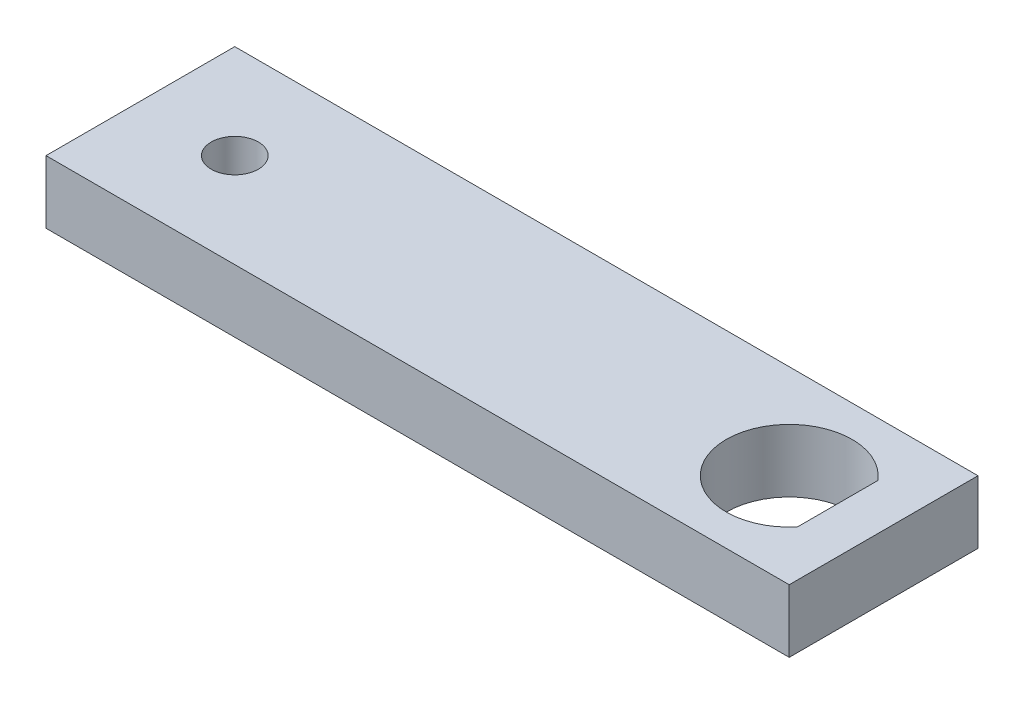
ISO-10303-21;
HEADER;
FILE_DESCRIPTION(('STEP AP214'),'2;1');
FILE_NAME('part.step','',(''),(''),'','','');
FILE_SCHEMA(('AUTOMOTIVE_DESIGN { 1 0 10303 214 1 1 1 1 }'));
ENDSEC;
DATA;
#1=APPLICATION_CONTEXT('core data for automotive mechanical design processes');
#2=APPLICATION_PROTOCOL_DEFINITION('international standard','automotive_design',2000,#1);
#3=PRODUCT_CONTEXT('',#1,'mechanical');
#4=PRODUCT('Part','Part','',(#3));
#5=PRODUCT_RELATED_PRODUCT_CATEGORY('part','',(#4));
#6=PRODUCT_DEFINITION_FORMATION('','',#4);
#7=PRODUCT_DEFINITION_CONTEXT('part definition',#1,'design');
#8=PRODUCT_DEFINITION('design','',#6,#7);
#9=PRODUCT_DEFINITION_SHAPE('','',#8);
#10=(LENGTH_UNIT() NAMED_UNIT(*) SI_UNIT(.MILLI.,.METRE.));
#11=(NAMED_UNIT(*) PLANE_ANGLE_UNIT() SI_UNIT($,.RADIAN.));
#12=(NAMED_UNIT(*) SI_UNIT($,.STERADIAN.) SOLID_ANGLE_UNIT());
#13=UNCERTAINTY_MEASURE_WITH_UNIT(LENGTH_MEASURE(1.E-05),#10,'distance_accuracy_value','');
#14=(GEOMETRIC_REPRESENTATION_CONTEXT(3) GLOBAL_UNCERTAINTY_ASSIGNED_CONTEXT((#13)) GLOBAL_UNIT_ASSIGNED_CONTEXT((#10,
#11,#12)) REPRESENTATION_CONTEXT('',''));
#15=CARTESIAN_POINT('',(0.,0.,0.));
#16=DIRECTION('',(0.,0.,1.));
#17=DIRECTION('',(1.,0.,0.));
#18=AXIS2_PLACEMENT_3D('',#15,#16,#17);
#19=CARTESIAN_POINT('',(0.,0.,19.05));
#20=DIRECTION('',(-1.,0.,0.));
#21=DIRECTION('',(0.,0.,1.));
#22=AXIS2_PLACEMENT_3D('',#19,#20,#21);
#23=PLANE('',#22);
#24=DIRECTION('',(0.,1.,0.));
#25=VECTOR('',#24,1.);
#26=CARTESIAN_POINT('',(0.,0.,0.));
#27=LINE('',#26,#25);
#28=CARTESIAN_POINT('',(0.,0.,0.));
#29=VERTEX_POINT('',#28);
#30=CARTESIAN_POINT('',(0.,6.35000000000001,0.));
#31=VERTEX_POINT('',#30);
#32=EDGE_CURVE('E107',#29,#31,#27,.T.);
#33=ORIENTED_EDGE('',*,*,#32,.F.);
#34=DIRECTION('',(0.,0.,-1.));
#35=VECTOR('',#34,1.);
#36=CARTESIAN_POINT('',(0.,0.,19.05));
#37=LINE('',#36,#35);
#38=CARTESIAN_POINT('',(0.,0.,19.05));
#39=VERTEX_POINT('',#38);
#40=EDGE_CURVE('E11',#39,#29,#37,.T.);
#41=ORIENTED_EDGE('',*,*,#40,.F.);
#42=DIRECTION('',(0.,1.,0.));
#43=VECTOR('',#42,1.);
#44=CARTESIAN_POINT('',(0.,0.,19.05));
#45=LINE('',#44,#43);
#46=CARTESIAN_POINT('',(0.,6.35000000000001,19.05));
#47=VERTEX_POINT('',#46);
#48=EDGE_CURVE('E109',#39,#47,#45,.T.);
#49=ORIENTED_EDGE('',*,*,#48,.T.);
#50=DIRECTION('',(0.,0.,-1.));
#51=VECTOR('',#50,1.);
#52=CARTESIAN_POINT('',(0.,6.35000000000001,19.05));
#53=LINE('',#52,#51);
#54=EDGE_CURVE('E37',#47,#31,#53,.T.);
#55=ORIENTED_EDGE('',*,*,#54,.T.);
#56=EDGE_LOOP('',(#33,#41,#49,#55));
#57=FACE_BOUND('',#56,.T.);
#58=ADVANCED_FACE('F34',(#57),#23,.T.);
#59=CARTESIAN_POINT('',(0.,0.,19.05));
#60=DIRECTION('',(0.,1.,0.));
#61=DIRECTION('',(0.,0.,1.));
#62=AXIS2_PLACEMENT_3D('',#59,#60,#61);
#63=PLANE('',#62);
#64=CARTESIAN_POINT('',(9.525,0.,9.525));
#65=DIRECTION('',(0.,1.,0.));
#66=DIRECTION('',(-1.,0.,0.));
#67=AXIS2_PLACEMENT_3D('',#64,#65,#66);
#68=CIRCLE('',#67,2.38125);
#69=CARTESIAN_POINT('',(7.14375,0.,9.525));
#70=VERTEX_POINT('',#69);
#71=EDGE_CURVE('E105',#70,#70,#68,.T.);
#72=ORIENTED_EDGE('',*,*,#71,.T.);
#73=EDGE_LOOP('',(#72));
#74=FACE_BOUND('',#73,.T.);
#75=DIRECTION('',(0.,0.,1.));
#76=VECTOR('',#75,1.);
#77=CARTESIAN_POINT('',(70.3645,0.,5.47342132619888));
#78=LINE('',#77,#76);
#79=CARTESIAN_POINT('',(70.3645,0.,5.47342132619887));
#80=VERTEX_POINT('',#79);
#81=CARTESIAN_POINT('',(70.3645,0.,13.5765786738011));
#82=VERTEX_POINT('',#81);
#83=EDGE_CURVE('E86',#80,#82,#78,.T.);
#84=ORIENTED_EDGE('',*,*,#83,.F.);
#85=CARTESIAN_POINT('',(65.475,0.,9.525));
#86=DIRECTION('',(0.,1.,0.));
#87=DIRECTION('',(-1.,0.,0.));
#88=AXIS2_PLACEMENT_3D('',#85,#86,#87);
#89=CIRCLE('',#88,6.35);
#90=EDGE_CURVE('E50',#80,#82,#89,.T.);
#91=ORIENTED_EDGE('',*,*,#90,.T.);
#92=EDGE_LOOP('',(#84,#91));
#93=FACE_BOUND('',#92,.T.);
#94=DIRECTION('',(1.,0.,0.));
#95=VECTOR('',#94,1.);
#96=CARTESIAN_POINT('',(0.,0.,0.));
#97=LINE('',#96,#95);
#98=CARTESIAN_POINT('',(75.,0.,0.));
#99=VERTEX_POINT('',#98);
#100=EDGE_CURVE('E113',#29,#99,#97,.T.);
#101=ORIENTED_EDGE('',*,*,#100,.T.);
#102=DIRECTION('',(0.,0.,-1.));
#103=VECTOR('',#102,1.);
#104=CARTESIAN_POINT('',(75.,0.,19.05));
#105=LINE('',#104,#103);
#106=CARTESIAN_POINT('',(75.,0.,19.05));
#107=VERTEX_POINT('',#106);
#108=EDGE_CURVE('E42',#107,#99,#105,.T.);
#109=ORIENTED_EDGE('',*,*,#108,.F.);
#110=DIRECTION('',(1.,0.,0.));
#111=VECTOR('',#110,1.);
#112=CARTESIAN_POINT('',(0.,0.,19.05));
#113=LINE('',#112,#111);
#114=EDGE_CURVE('E118',#39,#107,#113,.T.);
#115=ORIENTED_EDGE('',*,*,#114,.F.);
#116=ORIENTED_EDGE('',*,*,#40,.T.);
#117=EDGE_LOOP('',(#101,#109,#115,#116));
#118=FACE_BOUND('',#117,.T.);
#119=ADVANCED_FACE('F96',(#74,#93,#118),#63,.F.);
#120=CARTESIAN_POINT('',(75.,6.34999999999999,19.05));
#121=DIRECTION('',(1.,0.,0.));
#122=DIRECTION('',(0.,0.,-1.));
#123=AXIS2_PLACEMENT_3D('',#120,#121,#122);
#124=PLANE('',#123);
#125=DIRECTION('',(0.,-1.,0.));
#126=VECTOR('',#125,1.);
#127=CARTESIAN_POINT('',(75.,6.34999999999999,0.));
#128=LINE('',#127,#126);
#129=CARTESIAN_POINT('',(75.,6.34999999999999,0.));
#130=VERTEX_POINT('',#129);
#131=EDGE_CURVE('E125',#130,#99,#128,.T.);
#132=ORIENTED_EDGE('',*,*,#131,.F.);
#133=DIRECTION('',(0.,0.,-1.));
#134=VECTOR('',#133,1.);
#135=CARTESIAN_POINT('',(75.,6.34999999999999,19.05));
#136=LINE('',#135,#134);
#137=CARTESIAN_POINT('',(75.,6.34999999999999,19.05));
#138=VERTEX_POINT('',#137);
#139=EDGE_CURVE('E131',#138,#130,#136,.T.);
#140=ORIENTED_EDGE('',*,*,#139,.F.);
#141=DIRECTION('',(0.,-1.,0.));
#142=VECTOR('',#141,1.);
#143=CARTESIAN_POINT('',(75.,6.34999999999999,19.05));
#144=LINE('',#143,#142);
#145=EDGE_CURVE('E115',#138,#107,#144,.T.);
#146=ORIENTED_EDGE('',*,*,#145,.T.);
#147=ORIENTED_EDGE('',*,*,#108,.T.);
#148=EDGE_LOOP('',(#132,#140,#146,#147));
#149=FACE_BOUND('',#148,.T.);
#150=ADVANCED_FACE('F150',(#149),#124,.T.);
#151=CARTESIAN_POINT('',(75.,6.34999999999999,19.05));
#152=DIRECTION('',(0.,-1.,0.));
#153=DIRECTION('',(1.,0.,0.));
#154=AXIS2_PLACEMENT_3D('',#151,#152,#153);
#155=PLANE('',#154);
#156=CARTESIAN_POINT('',(9.525,6.35000000000001,9.525));
#157=DIRECTION('',(0.,1.,0.));
#158=DIRECTION('',(-1.,0.,0.));
#159=AXIS2_PLACEMENT_3D('',#156,#157,#158);
#160=CIRCLE('',#159,2.38125);
#161=CARTESIAN_POINT('',(7.14375,6.35000000000001,9.525));
#162=VERTEX_POINT('',#161);
#163=EDGE_CURVE('E102',#162,#162,#160,.T.);
#164=ORIENTED_EDGE('',*,*,#163,.F.);
#165=EDGE_LOOP('',(#164));
#166=FACE_BOUND('',#165,.T.);
#167=DIRECTION('',(0.,0.,1.));
#168=VECTOR('',#167,1.);
#169=CARTESIAN_POINT('',(70.3645,6.35,5.47342132619888));
#170=LINE('',#169,#168);
#171=CARTESIAN_POINT('',(70.3645,6.35,5.47342132619888));
#172=VERTEX_POINT('',#171);
#173=CARTESIAN_POINT('',(70.3645,6.34999999999999,13.5765786738011));
#174=VERTEX_POINT('',#173);
#175=EDGE_CURVE('E98',#172,#174,#170,.T.);
#176=ORIENTED_EDGE('',*,*,#175,.T.);
#177=CARTESIAN_POINT('',(65.475,6.35000000000001,9.525));
#178=DIRECTION('',(0.,1.,0.));
#179=DIRECTION('',(-1.,0.,0.));
#180=AXIS2_PLACEMENT_3D('',#177,#178,#179);
#181=CIRCLE('',#180,6.35);
#182=EDGE_CURVE('E55',#172,#174,#181,.T.);
#183=ORIENTED_EDGE('',*,*,#182,.F.);
#184=EDGE_LOOP('',(#176,#183));
#185=FACE_BOUND('',#184,.T.);
#186=DIRECTION('',(-1.,0.,0.));
#187=VECTOR('',#186,1.);
#188=CARTESIAN_POINT('',(75.,6.34999999999999,0.));
#189=LINE('',#188,#187);
#190=EDGE_CURVE('E122',#130,#31,#189,.T.);
#191=ORIENTED_EDGE('',*,*,#190,.T.);
#192=ORIENTED_EDGE('',*,*,#54,.F.);
#193=DIRECTION('',(-1.,0.,0.));
#194=VECTOR('',#193,1.);
#195=CARTESIAN_POINT('',(75.,6.34999999999999,19.05));
#196=LINE('',#195,#194);
#197=EDGE_CURVE('E112',#138,#47,#196,.T.);
#198=ORIENTED_EDGE('',*,*,#197,.F.);
#199=ORIENTED_EDGE('',*,*,#139,.T.);
#200=EDGE_LOOP('',(#191,#192,#198,#199));
#201=FACE_BOUND('',#200,.T.);
#202=ADVANCED_FACE('F139',(#166,#185,#201),#155,.F.);
#203=CARTESIAN_POINT('',(0.,0.,19.05));
#204=DIRECTION('',(0.,0.,-1.));
#205=DIRECTION('',(-1.,0.,0.));
#206=AXIS2_PLACEMENT_3D('',#203,#204,#205);
#207=PLANE('',#206);
#208=ORIENTED_EDGE('',*,*,#48,.F.);
#209=ORIENTED_EDGE('',*,*,#114,.T.);
#210=ORIENTED_EDGE('',*,*,#145,.F.);
#211=ORIENTED_EDGE('',*,*,#197,.T.);
#212=EDGE_LOOP('',(#208,#209,#210,#211));
#213=FACE_BOUND('',#212,.T.);
#214=ADVANCED_FACE('F148',(#213),#207,.F.);
#215=CARTESIAN_POINT('',(0.,0.,0.));
#216=DIRECTION('',(0.,0.,-1.));
#217=DIRECTION('',(-1.,0.,0.));
#218=AXIS2_PLACEMENT_3D('',#215,#216,#217);
#219=PLANE('',#218);
#220=ORIENTED_EDGE('',*,*,#32,.T.);
#221=ORIENTED_EDGE('',*,*,#190,.F.);
#222=ORIENTED_EDGE('',*,*,#131,.T.);
#223=ORIENTED_EDGE('',*,*,#100,.F.);
#224=EDGE_LOOP('',(#220,#221,#222,#223));
#225=FACE_BOUND('',#224,.T.);
#226=ADVANCED_FACE('F143',(#225),#219,.T.);
#227=CARTESIAN_POINT('',(65.475,0.,9.525));
#228=DIRECTION('',(0.,1.,0.));
#229=DIRECTION('',(-1.,0.,0.));
#230=AXIS2_PLACEMENT_3D('',#227,#228,#229);
#231=CYLINDRICAL_SURFACE('',#230,6.35);
#232=ORIENTED_EDGE('',*,*,#182,.T.);
#233=DIRECTION('',(0.,1.,0.));
#234=VECTOR('',#233,1.);
#235=CARTESIAN_POINT('',(70.3645,0.,13.5765786738011));
#236=LINE('',#235,#234);
#237=EDGE_CURVE('E89',#82,#174,#236,.T.);
#238=ORIENTED_EDGE('',*,*,#237,.F.);
#239=ORIENTED_EDGE('',*,*,#90,.F.);
#240=DIRECTION('',(0.,1.,0.));
#241=VECTOR('',#240,1.);
#242=CARTESIAN_POINT('',(70.3645,0.,5.47342132619888));
#243=LINE('',#242,#241);
#244=EDGE_CURVE('E91',#80,#172,#243,.T.);
#245=ORIENTED_EDGE('',*,*,#244,.T.);
#246=EDGE_LOOP('',(#232,#238,#239,#245));
#247=FACE_BOUND('',#246,.T.);
#248=ADVANCED_FACE('F94',(#247),#231,.F.);
#249=CARTESIAN_POINT('',(70.3645,0.,5.47342132619888));
#250=DIRECTION('',(-1.,0.,0.));
#251=DIRECTION('',(0.,-1.,0.));
#252=AXIS2_PLACEMENT_3D('',#249,#250,#251);
#253=PLANE('',#252);
#254=ORIENTED_EDGE('',*,*,#175,.F.);
#255=ORIENTED_EDGE('',*,*,#244,.F.);
#256=ORIENTED_EDGE('',*,*,#83,.T.);
#257=ORIENTED_EDGE('',*,*,#237,.T.);
#258=EDGE_LOOP('',(#254,#255,#256,#257));
#259=FACE_BOUND('',#258,.T.);
#260=ADVANCED_FACE('F88',(#259),#253,.T.);
#261=CARTESIAN_POINT('',(9.525,0.,9.525));
#262=DIRECTION('',(0.,1.,0.));
#263=DIRECTION('',(-1.,0.,0.));
#264=AXIS2_PLACEMENT_3D('',#261,#262,#263);
#265=CYLINDRICAL_SURFACE('',#264,2.38125);
#266=CARTESIAN_POINT('',(7.14375,0.,9.525));
#267=CARTESIAN_POINT('',(7.14375,0.0661458333333243,9.525));
#268=CARTESIAN_POINT('',(7.14375,0.132291666666658,9.525));
#269=CARTESIAN_POINT('',(7.14375,0.264583333333325,9.525));
#270=CARTESIAN_POINT('',(7.14375,0.330729166666659,9.525));
#271=CARTESIAN_POINT('',(7.14375,0.463020833333326,9.525));
#272=CARTESIAN_POINT('',(7.14375,0.529166666666659,9.525));
#273=CARTESIAN_POINT('',(7.14375,0.661458333333326,9.525));
#274=CARTESIAN_POINT('',(7.14375,0.72760416666666,9.525));
#275=CARTESIAN_POINT('',(7.14375,0.859895833333327,9.525));
#276=CARTESIAN_POINT('',(7.14375,0.926041666666661,9.525));
#277=CARTESIAN_POINT('',(7.14375,1.05833333333333,9.525));
#278=CARTESIAN_POINT('',(7.14375,1.12447916666666,9.525));
#279=CARTESIAN_POINT('',(7.14375,1.25677083333333,9.525));
#280=CARTESIAN_POINT('',(7.14375,1.32291666666666,9.525));
#281=CARTESIAN_POINT('',(7.14375,1.45520833333333,9.525));
#282=CARTESIAN_POINT('',(7.14375,1.52135416666666,9.525));
#283=CARTESIAN_POINT('',(7.14375,1.65364583333333,9.525));
#284=CARTESIAN_POINT('',(7.14375,1.71979166666666,9.525));
#285=CARTESIAN_POINT('',(7.14375,1.85208333333333,9.525));
#286=CARTESIAN_POINT('',(7.14375,1.91822916666666,9.525));
#287=CARTESIAN_POINT('',(7.14375,2.05052083333333,9.525));
#288=CARTESIAN_POINT('',(7.14375,2.11666666666666,9.525));
#289=CARTESIAN_POINT('',(7.14375,2.24895833333333,9.525));
#290=CARTESIAN_POINT('',(7.14375,2.31510416666667,9.525));
#291=CARTESIAN_POINT('',(7.14375,2.44739583333333,9.525));
#292=CARTESIAN_POINT('',(7.14375,2.51354166666667,9.525));
#293=CARTESIAN_POINT('',(7.14375,2.64583333333333,9.525));
#294=CARTESIAN_POINT('',(7.14375,2.71197916666667,9.525));
#295=CARTESIAN_POINT('',(7.14375,2.84427083333333,9.525));
#296=CARTESIAN_POINT('',(7.14375,2.91041666666667,9.525));
#297=CARTESIAN_POINT('',(7.14375,3.04270833333334,9.525));
#298=CARTESIAN_POINT('',(7.14375,3.10885416666667,9.525));
#299=CARTESIAN_POINT('',(7.14375,3.24114583333334,9.525));
#300=CARTESIAN_POINT('',(7.14375,3.30729166666667,9.525));
#301=CARTESIAN_POINT('',(7.14375,3.43958333333334,9.525));
#302=CARTESIAN_POINT('',(7.14375,3.50572916666667,9.525));
#303=CARTESIAN_POINT('',(7.14375,3.63802083333334,9.525));
#304=CARTESIAN_POINT('',(7.14375,3.70416666666667,9.525));
#305=CARTESIAN_POINT('',(7.14375,3.83645833333334,9.525));
#306=CARTESIAN_POINT('',(7.14375,3.90260416666667,9.525));
#307=CARTESIAN_POINT('',(7.14375,4.03489583333334,9.525));
#308=CARTESIAN_POINT('',(7.14375,4.10104166666667,9.525));
#309=CARTESIAN_POINT('',(7.14375,4.23333333333334,9.525));
#310=CARTESIAN_POINT('',(7.14375,4.29947916666667,9.525));
#311=CARTESIAN_POINT('',(7.14375,4.43177083333334,9.525));
#312=CARTESIAN_POINT('',(7.14375,4.49791666666667,9.525));
#313=CARTESIAN_POINT('',(7.14375,4.63020833333334,9.525));
#314=CARTESIAN_POINT('',(7.14375,4.69635416666667,9.525));
#315=CARTESIAN_POINT('',(7.14375,4.82864583333334,9.525));
#316=CARTESIAN_POINT('',(7.14375,4.89479166666668,9.525));
#317=CARTESIAN_POINT('',(7.14375,5.02708333333334,9.525));
#318=CARTESIAN_POINT('',(7.14375,5.09322916666668,9.525));
#319=CARTESIAN_POINT('',(7.14375,5.22552083333334,9.525));
#320=CARTESIAN_POINT('',(7.14375,5.29166666666668,9.525));
#321=CARTESIAN_POINT('',(7.14375,5.42395833333334,9.525));
#322=CARTESIAN_POINT('',(7.14375,5.49010416666668,9.525));
#323=CARTESIAN_POINT('',(7.14375,5.62239583333334,9.525));
#324=CARTESIAN_POINT('',(7.14375,5.68854166666668,9.525));
#325=CARTESIAN_POINT('',(7.14375,5.82083333333335,9.525));
#326=CARTESIAN_POINT('',(7.14375,5.88697916666668,9.525));
#327=CARTESIAN_POINT('',(7.14375,6.01927083333335,9.525));
#328=CARTESIAN_POINT('',(7.14375,6.08541666666668,9.525));
#329=CARTESIAN_POINT('',(7.14375,6.21770833333335,9.525));
#330=CARTESIAN_POINT('',(7.14375,6.28385416666668,9.525));
#331=CARTESIAN_POINT('',(7.14375,6.35000000000001,9.525));
#332=B_SPLINE_CURVE_WITH_KNOTS('',3,(#266,#267,#268,#269,#270,#271,#272,#273,#274,#275,#276,
#277,#278,#279,#280,#281,#282,#283,#284,#285,#286,#287,#288,#289,#290,#291,#292,#293,#294,#295,
#296,#297,#298,#299,#300,#301,#302,#303,#304,#305,#306,#307,#308,#309,#310,#311,#312,#313,#314,
#315,#316,#317,#318,#319,#320,#321,#322,#323,#324,#325,#326,#327,#328,#329,#330,#331),
.UNSPECIFIED.,.F.,.F.,(4,2,2,2,2,2,2,2,2,2,2,2,2,2,2,2,2,2,2,2,2,2,2,2,2,2,2,2,2,2,2,2,4),(0.,
0.198437500000001,0.396875000000001,0.595312500000002,0.793750000000003,0.992187500000003,
1.190625,1.38906250000001,1.58750000000001,1.78593750000001,1.98437500000001,2.18281250000001,
2.38125000000001,2.57968750000001,2.77812500000001,2.97656250000001,3.17500000000001,
3.37343750000001,3.57187500000001,3.77031250000001,3.96875000000001,4.16718750000001,
4.36562500000002,4.56406250000002,4.76250000000002,4.96093750000002,5.15937500000002,
5.35781250000002,5.55625000000002,5.75468750000002,5.95312500000002,6.15156250000002,
6.35000000000002),.UNSPECIFIED.);
#333=EDGE_CURVE('BSEAM187',#70,#162,#332,.T.);
#334=ORIENTED_EDGE('',*,*,#71,.F.);
#335=ORIENTED_EDGE('',*,*,#163,.T.);
#336=ORIENTED_EDGE('',*,*,#333,.T.);
#337=ORIENTED_EDGE('',*,*,#333,.F.);
#338=EDGE_LOOP('',(#334,#336,#335,#337));
#339=FACE_BOUND('',#338,.T.);
#340=ADVANCED_FACE('F187',(#339),#265,.F.);
#341=CLOSED_SHELL('',(#58,#119,#150,#202,#214,#226,#248,#260,#340));
#342=MANIFOLD_SOLID_BREP('B2',#341);
#343=ADVANCED_BREP_SHAPE_REPRESENTATION('',(#18,#342),#14);
#344=SHAPE_DEFINITION_REPRESENTATION(#9,#343);
ENDSEC;
END-ISO-10303-21;
